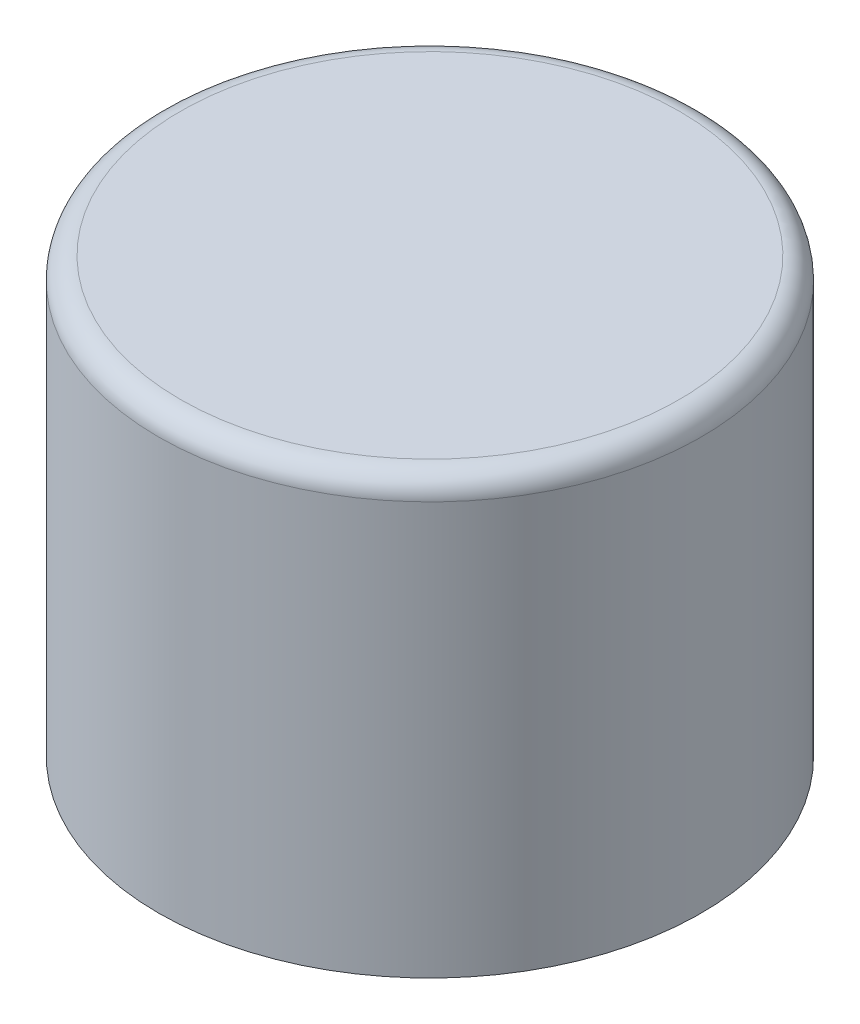
ISO-10303-21;
HEADER;
FILE_DESCRIPTION(('STEP AP214'),'2;1');
FILE_NAME('part.step','',(''),(''),'','','');
FILE_SCHEMA(('AUTOMOTIVE_DESIGN { 1 0 10303 214 1 1 1 1 }'));
ENDSEC;
DATA;
#1=APPLICATION_CONTEXT('core data for automotive mechanical design processes');
#2=APPLICATION_PROTOCOL_DEFINITION('international standard','automotive_design',2000,#1);
#3=PRODUCT_CONTEXT('',#1,'mechanical');
#4=PRODUCT('Part','Part','',(#3));
#5=PRODUCT_RELATED_PRODUCT_CATEGORY('part','',(#4));
#6=PRODUCT_DEFINITION_FORMATION('','',#4);
#7=PRODUCT_DEFINITION_CONTEXT('part definition',#1,'design');
#8=PRODUCT_DEFINITION('design','',#6,#7);
#9=PRODUCT_DEFINITION_SHAPE('','',#8);
#10=(LENGTH_UNIT() NAMED_UNIT(*) SI_UNIT(.MILLI.,.METRE.));
#11=(NAMED_UNIT(*) PLANE_ANGLE_UNIT() SI_UNIT($,.RADIAN.));
#12=(NAMED_UNIT(*) SI_UNIT($,.STERADIAN.) SOLID_ANGLE_UNIT());
#13=UNCERTAINTY_MEASURE_WITH_UNIT(LENGTH_MEASURE(1.E-05),#10,'distance_accuracy_value','');
#14=(GEOMETRIC_REPRESENTATION_CONTEXT(3) GLOBAL_UNCERTAINTY_ASSIGNED_CONTEXT((#13)) GLOBAL_UNIT_ASSIGNED_CONTEXT((#10,
#11,#12)) REPRESENTATION_CONTEXT('',''));
#15=CARTESIAN_POINT('',(0.,0.,0.));
#16=DIRECTION('',(0.,0.,1.));
#17=DIRECTION('',(1.,0.,0.));
#18=AXIS2_PLACEMENT_3D('',#15,#16,#17);
#19=CARTESIAN_POINT('',(0.,50.8,0.));
#20=DIRECTION('',(0.,-1.,0.));
#21=DIRECTION('',(0.,0.,-1.));
#22=AXIS2_PLACEMENT_3D('',#19,#20,#21);
#23=CYLINDRICAL_SURFACE('',#22,31.75);
#24=CARTESIAN_POINT('',(0.,48.26,0.));
#25=DIRECTION('',(0.,1.,0.));
#26=DIRECTION('',(0.,0.,1.));
#27=AXIS2_PLACEMENT_3D('',#24,#25,#26);
#28=CIRCLE('',#27,31.75);
#29=CARTESIAN_POINT('',(0.,48.26,31.75));
#30=VERTEX_POINT('',#29);
#31=EDGE_CURVE('E53',#30,#30,#28,.F.);
#32=ORIENTED_EDGE('',*,*,#31,.T.);
#33=EDGE_LOOP('',(#32));
#34=FACE_BOUND('',#33,.T.);
#35=CARTESIAN_POINT('',(0.,0.,0.));
#36=DIRECTION('',(0.,1.,0.));
#37=DIRECTION('',(0.,0.,1.));
#38=AXIS2_PLACEMENT_3D('',#35,#36,#37);
#39=CIRCLE('',#38,31.75);
#40=CARTESIAN_POINT('',(0.,0.,31.75));
#41=VERTEX_POINT('',#40);
#42=EDGE_CURVE('E64',#41,#41,#39,.T.);
#43=ORIENTED_EDGE('',*,*,#42,.T.);
#44=EDGE_LOOP('',(#43));
#45=FACE_BOUND('',#44,.T.);
#46=ADVANCED_FACE('F39',(#34,#45),#23,.T.);
#47=CARTESIAN_POINT('',(0.,50.8,0.));
#48=DIRECTION('',(0.,1.,0.));
#49=DIRECTION('',(0.,0.,1.));
#50=AXIS2_PLACEMENT_3D('',#47,#48,#49);
#51=PLANE('',#50);
#52=CARTESIAN_POINT('',(0.,50.8,0.));
#53=DIRECTION('',(0.,1.,0.));
#54=DIRECTION('',(0.,0.,1.));
#55=AXIS2_PLACEMENT_3D('',#52,#53,#54);
#56=CIRCLE('',#55,29.21);
#57=CARTESIAN_POINT('',(0.,50.8,29.21));
#58=VERTEX_POINT('',#57);
#59=EDGE_CURVE('E58',#58,#58,#56,.T.);
#60=ORIENTED_EDGE('',*,*,#59,.T.);
#61=EDGE_LOOP('',(#60));
#62=FACE_BOUND('',#61,.T.);
#63=ADVANCED_FACE('F88',(#62),#51,.T.);
#64=CARTESIAN_POINT('',(0.,0.,0.));
#65=DIRECTION('',(0.,1.,0.));
#66=DIRECTION('',(0.,0.,1.));
#67=AXIS2_PLACEMENT_3D('',#64,#65,#66);
#68=PLANE('',#67);
#69=CARTESIAN_POINT('',(0.,0.,0.));
#70=DIRECTION('',(0.,1.,0.));
#71=DIRECTION('',(0.,0.,1.));
#72=AXIS2_PLACEMENT_3D('',#69,#70,#71);
#73=CIRCLE('',#72,31.115);
#74=CARTESIAN_POINT('',(0.,0.,31.115));
#75=VERTEX_POINT('',#74);
#76=EDGE_CURVE('E48',#75,#75,#73,.T.);
#77=ORIENTED_EDGE('',*,*,#76,.T.);
#78=EDGE_LOOP('',(#77));
#79=FACE_BOUND('',#78,.T.);
#80=ORIENTED_EDGE('',*,*,#42,.F.);
#81=EDGE_LOOP('',(#80));
#82=FACE_BOUND('',#81,.T.);
#83=ADVANCED_FACE('F84',(#79,#82),#68,.F.);
#84=CARTESIAN_POINT('',(0.,50.8,0.));
#85=DIRECTION('',(0.,-1.,0.));
#86=DIRECTION('',(0.,0.,-1.));
#87=AXIS2_PLACEMENT_3D('',#84,#85,#86);
#88=CYLINDRICAL_SURFACE('',#87,28.575);
#89=CARTESIAN_POINT('',(0.,2.54,0.));
#90=DIRECTION('',(0.,1.,0.));
#91=DIRECTION('',(0.,0.,1.));
#92=AXIS2_PLACEMENT_3D('',#89,#90,#91);
#93=CIRCLE('',#92,28.575);
#94=CARTESIAN_POINT('',(0.,2.54,28.575));
#95=VERTEX_POINT('',#94);
#96=EDGE_CURVE('E10',#95,#95,#93,.F.);
#97=ORIENTED_EDGE('',*,*,#96,.T.);
#98=EDGE_LOOP('',(#97));
#99=FACE_BOUND('',#98,.T.);
#100=CARTESIAN_POINT('',(0.,47.625,0.));
#101=DIRECTION('',(0.,1.,0.));
#102=DIRECTION('',(0.,0.,1.));
#103=AXIS2_PLACEMENT_3D('',#100,#101,#102);
#104=CIRCLE('',#103,28.575);
#105=CARTESIAN_POINT('',(0.,47.625,28.575));
#106=VERTEX_POINT('',#105);
#107=EDGE_CURVE('E68',#106,#106,#104,.T.);
#108=ORIENTED_EDGE('',*,*,#107,.T.);
#109=EDGE_LOOP('',(#108));
#110=FACE_BOUND('',#109,.T.);
#111=ADVANCED_FACE('F73',(#99,#110),#88,.F.);
#112=CARTESIAN_POINT('',(0.,47.625,0.));
#113=DIRECTION('',(0.,1.,0.));
#114=DIRECTION('',(0.,0.,1.));
#115=AXIS2_PLACEMENT_3D('',#112,#113,#114);
#116=PLANE('',#115);
#117=ORIENTED_EDGE('',*,*,#107,.F.);
#118=EDGE_LOOP('',(#117));
#119=FACE_BOUND('',#118,.T.);
#120=ADVANCED_FACE('F75',(#119),#116,.F.);
#121=CARTESIAN_POINT('',(0.,48.26,0.));
#122=DIRECTION('',(0.,1.,0.));
#123=DIRECTION('',(0.,0.,1.));
#124=AXIS2_PLACEMENT_3D('',#121,#122,#123);
#125=TOROIDAL_SURFACE('',#124,29.21,2.54);
#126=ORIENTED_EDGE('',*,*,#31,.F.);
#127=EDGE_LOOP('',(#126));
#128=FACE_BOUND('',#127,.T.);
#129=ORIENTED_EDGE('',*,*,#59,.F.);
#130=EDGE_LOOP('',(#129));
#131=FACE_BOUND('',#130,.T.);
#132=ADVANCED_FACE('F77',(#128,#131),#125,.T.);
#133=CARTESIAN_POINT('',(0.,0.,0.));
#134=DIRECTION('',(0.,-1.,0.));
#135=DIRECTION('',(0.,0.,-1.));
#136=AXIS2_PLACEMENT_3D('',#133,#134,#135);
#137=CONICAL_SURFACE('',#136,31.115,0.785398163397445);
#138=ORIENTED_EDGE('',*,*,#96,.F.);
#139=EDGE_LOOP('',(#138));
#140=FACE_BOUND('',#139,.T.);
#141=ORIENTED_EDGE('',*,*,#76,.F.);
#142=EDGE_LOOP('',(#141));
#143=FACE_BOUND('',#142,.T.);
#144=ADVANCED_FACE('F42',(#140,#143),#137,.F.);
#145=CLOSED_SHELL('',(#46,#63,#83,#111,#120,#132,#144));
#146=MANIFOLD_SOLID_BREP('B2',#145);
#147=ADVANCED_BREP_SHAPE_REPRESENTATION('',(#18,#146),#14);
#148=SHAPE_DEFINITION_REPRESENTATION(#9,#147);
ENDSEC;
END-ISO-10303-21;
